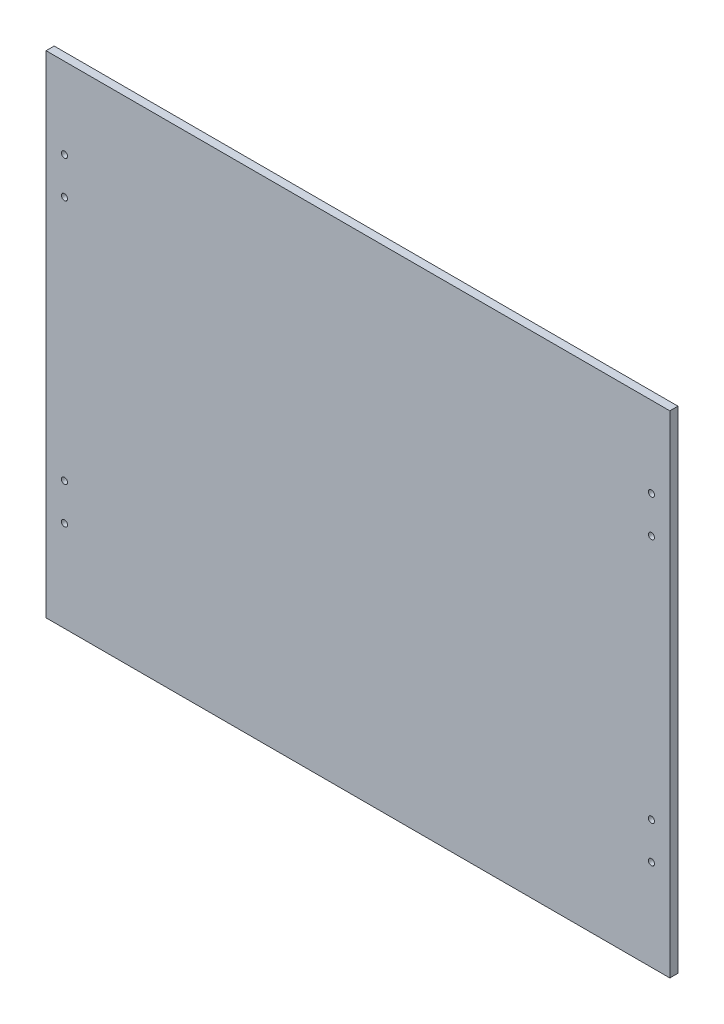
ISO-10303-21;
HEADER;
FILE_DESCRIPTION(('STEP AP214'),'2;1');
FILE_NAME('part.step','',(''),(''),'','','');
FILE_SCHEMA(('AUTOMOTIVE_DESIGN { 1 0 10303 214 1 1 1 1 }'));
ENDSEC;
DATA;
#1=APPLICATION_CONTEXT('core data for automotive mechanical design processes');
#2=APPLICATION_PROTOCOL_DEFINITION('international standard','automotive_design',2000,#1);
#3=PRODUCT_CONTEXT('',#1,'mechanical');
#4=PRODUCT('Part','Part','',(#3));
#5=PRODUCT_RELATED_PRODUCT_CATEGORY('part','',(#4));
#6=PRODUCT_DEFINITION_FORMATION('','',#4);
#7=PRODUCT_DEFINITION_CONTEXT('part definition',#1,'design');
#8=PRODUCT_DEFINITION('design','',#6,#7);
#9=PRODUCT_DEFINITION_SHAPE('','',#8);
#10=(LENGTH_UNIT() NAMED_UNIT(*) SI_UNIT(.MILLI.,.METRE.));
#11=(NAMED_UNIT(*) PLANE_ANGLE_UNIT() SI_UNIT($,.RADIAN.));
#12=(NAMED_UNIT(*) SI_UNIT($,.STERADIAN.) SOLID_ANGLE_UNIT());
#13=UNCERTAINTY_MEASURE_WITH_UNIT(LENGTH_MEASURE(1.E-05),#10,'distance_accuracy_value','');
#14=(GEOMETRIC_REPRESENTATION_CONTEXT(3) GLOBAL_UNCERTAINTY_ASSIGNED_CONTEXT((#13)) GLOBAL_UNIT_ASSIGNED_CONTEXT((#10,
#11,#12)) REPRESENTATION_CONTEXT('',''));
#15=CARTESIAN_POINT('',(0.,0.,0.));
#16=DIRECTION('',(0.,0.,1.));
#17=DIRECTION('',(1.,0.,0.));
#18=AXIS2_PLACEMENT_3D('',#15,#16,#17);
#19=CARTESIAN_POINT('',(0.,0.,3.3));
#20=DIRECTION('',(0.,0.,1.));
#21=DIRECTION('',(1.,0.,0.));
#22=AXIS2_PLACEMENT_3D('',#19,#20,#21);
#23=PLANE('',#22);
#24=CARTESIAN_POINT('',(-107.954545454545,-44.9714285714286,3.3));
#25=DIRECTION('',(0.,0.,1.));
#26=DIRECTION('',(1.,0.,0.));
#27=AXIS2_PLACEMENT_3D('',#24,#25,#26);
#28=CIRCLE('',#27,1.25);
#29=CARTESIAN_POINT('',(-106.704545454545,-44.9714285714286,3.3));
#30=VERTEX_POINT('',#29);
#31=EDGE_CURVE('E145',#30,#30,#28,.T.);
#32=ORIENTED_EDGE('',*,*,#31,.F.);
#33=EDGE_LOOP('',(#32));
#34=FACE_BOUND('',#33,.T.);
#35=CARTESIAN_POINT('',(-107.954545454545,-29.9714285714286,3.3));
#36=DIRECTION('',(0.,0.,1.));
#37=DIRECTION('',(1.,0.,0.));
#38=AXIS2_PLACEMENT_3D('',#35,#36,#37);
#39=CIRCLE('',#38,1.25);
#40=CARTESIAN_POINT('',(-106.704545454545,-29.9714285714286,3.3));
#41=VERTEX_POINT('',#40);
#42=EDGE_CURVE('E133',#41,#41,#39,.T.);
#43=ORIENTED_EDGE('',*,*,#42,.F.);
#44=EDGE_LOOP('',(#43));
#45=FACE_BOUND('',#44,.T.);
#46=CARTESIAN_POINT('',(131.045454545455,85.0285714285714,3.3));
#47=DIRECTION('',(0.,0.,1.));
#48=DIRECTION('',(1.,0.,0.));
#49=AXIS2_PLACEMENT_3D('',#46,#47,#48);
#50=CIRCLE('',#49,1.25000000000001);
#51=CARTESIAN_POINT('',(132.295454545455,85.0285714285714,3.3));
#52=VERTEX_POINT('',#51);
#53=EDGE_CURVE('E121',#52,#52,#50,.T.);
#54=ORIENTED_EDGE('',*,*,#53,.F.);
#55=EDGE_LOOP('',(#54));
#56=FACE_BOUND('',#55,.T.);
#57=CARTESIAN_POINT('',(-107.954545454545,85.0285714285714,3.3));
#58=DIRECTION('',(0.,0.,1.));
#59=DIRECTION('',(1.,0.,0.));
#60=AXIS2_PLACEMENT_3D('',#57,#58,#59);
#61=CIRCLE('',#60,1.25);
#62=CARTESIAN_POINT('',(-106.704545454545,85.0285714285714,3.3));
#63=VERTEX_POINT('',#62);
#64=EDGE_CURVE('E100',#63,#63,#61,.T.);
#65=ORIENTED_EDGE('',*,*,#64,.F.);
#66=EDGE_LOOP('',(#65));
#67=FACE_BOUND('',#66,.T.);
#68=DIRECTION('',(0.,-1.,0.));
#69=VECTOR('',#68,1.);
#70=CARTESIAN_POINT('',(-115.454545454545,117.928571428571,3.3));
#71=LINE('',#70,#69);
#72=CARTESIAN_POINT('',(-115.454545454545,117.928571428571,3.3));
#73=VERTEX_POINT('',#72);
#74=CARTESIAN_POINT('',(-115.454545454545,-82.0714285714286,3.3));
#75=VERTEX_POINT('',#74);
#76=EDGE_CURVE('E85',#73,#75,#71,.T.);
#77=ORIENTED_EDGE('',*,*,#76,.T.);
#78=DIRECTION('',(1.,0.,0.));
#79=VECTOR('',#78,1.);
#80=CARTESIAN_POINT('',(-115.454545454545,-82.0714285714286,3.3));
#81=LINE('',#80,#79);
#82=CARTESIAN_POINT('',(138.545454545455,-82.0714285714286,3.3));
#83=VERTEX_POINT('',#82);
#84=EDGE_CURVE('E80',#75,#83,#81,.T.);
#85=ORIENTED_EDGE('',*,*,#84,.T.);
#86=DIRECTION('',(0.,1.,0.));
#87=VECTOR('',#86,1.);
#88=CARTESIAN_POINT('',(138.545454545455,117.928571428571,3.3));
#89=LINE('',#88,#87);
#90=CARTESIAN_POINT('',(138.545454545455,117.928571428571,3.3));
#91=VERTEX_POINT('',#90);
#92=EDGE_CURVE('E83',#83,#91,#89,.T.);
#93=ORIENTED_EDGE('',*,*,#92,.T.);
#94=DIRECTION('',(-1.,0.,0.));
#95=VECTOR('',#94,1.);
#96=CARTESIAN_POINT('',(-115.454545454545,117.928571428571,3.3));
#97=LINE('',#96,#95);
#98=EDGE_CURVE('E50',#91,#73,#97,.T.);
#99=ORIENTED_EDGE('',*,*,#98,.T.);
#100=EDGE_LOOP('',(#77,#85,#93,#99));
#101=FACE_BOUND('',#100,.T.);
#102=CARTESIAN_POINT('',(-107.954545454545,70.0285714285714,3.3));
#103=DIRECTION('',(0.,0.,1.));
#104=DIRECTION('',(1.,0.,0.));
#105=AXIS2_PLACEMENT_3D('',#102,#103,#104);
#106=CIRCLE('',#105,1.25);
#107=CARTESIAN_POINT('',(-106.704545454545,70.0285714285714,3.3));
#108=VERTEX_POINT('',#107);
#109=EDGE_CURVE('E115',#108,#108,#106,.T.);
#110=ORIENTED_EDGE('',*,*,#109,.F.);
#111=EDGE_LOOP('',(#110));
#112=FACE_BOUND('',#111,.T.);
#113=CARTESIAN_POINT('',(131.045454545455,70.0285714285714,3.3));
#114=DIRECTION('',(0.,0.,1.));
#115=DIRECTION('',(1.,0.,0.));
#116=AXIS2_PLACEMENT_3D('',#113,#114,#115);
#117=CIRCLE('',#116,1.25000000000001);
#118=CARTESIAN_POINT('',(132.295454545455,70.0285714285714,3.3));
#119=VERTEX_POINT('',#118);
#120=EDGE_CURVE('E127',#119,#119,#117,.T.);
#121=ORIENTED_EDGE('',*,*,#120,.F.);
#122=EDGE_LOOP('',(#121));
#123=FACE_BOUND('',#122,.T.);
#124=CARTESIAN_POINT('',(131.045454545455,-29.9714285714286,3.3));
#125=DIRECTION('',(0.,0.,1.));
#126=DIRECTION('',(1.,0.,0.));
#127=AXIS2_PLACEMENT_3D('',#124,#125,#126);
#128=CIRCLE('',#127,1.25000000000001);
#129=CARTESIAN_POINT('',(132.295454545455,-29.9714285714286,3.3));
#130=VERTEX_POINT('',#129);
#131=EDGE_CURVE('E139',#130,#130,#128,.T.);
#132=ORIENTED_EDGE('',*,*,#131,.F.);
#133=EDGE_LOOP('',(#132));
#134=FACE_BOUND('',#133,.T.);
#135=CARTESIAN_POINT('',(131.045454545455,-44.9714285714286,3.3));
#136=DIRECTION('',(0.,0.,1.));
#137=DIRECTION('',(1.,0.,0.));
#138=AXIS2_PLACEMENT_3D('',#135,#136,#137);
#139=CIRCLE('',#138,1.25000000000001);
#140=CARTESIAN_POINT('',(132.295454545455,-44.9714285714286,3.3));
#141=VERTEX_POINT('',#140);
#142=EDGE_CURVE('E151',#141,#141,#139,.T.);
#143=ORIENTED_EDGE('',*,*,#142,.F.);
#144=EDGE_LOOP('',(#143));
#145=FACE_BOUND('',#144,.T.);
#146=ADVANCED_FACE('F33',(#34,#45,#56,#67,#101,#112,#123,#134,#145),#23,.T.);
#147=CARTESIAN_POINT('',(0.,0.,0.));
#148=DIRECTION('',(0.,0.,1.));
#149=DIRECTION('',(1.,0.,0.));
#150=AXIS2_PLACEMENT_3D('',#147,#148,#149);
#151=PLANE('',#150);
#152=DIRECTION('',(0.,-1.,0.));
#153=VECTOR('',#152,1.);
#154=CARTESIAN_POINT('',(-115.454545454545,117.928571428571,0.));
#155=LINE('',#154,#153);
#156=CARTESIAN_POINT('',(-115.454545454545,117.928571428571,0.));
#157=VERTEX_POINT('',#156);
#158=CARTESIAN_POINT('',(-115.454545454545,-82.0714285714286,0.));
#159=VERTEX_POINT('',#158);
#160=EDGE_CURVE('E97',#157,#159,#155,.T.);
#161=ORIENTED_EDGE('',*,*,#160,.F.);
#162=DIRECTION('',(-1.,0.,0.));
#163=VECTOR('',#162,1.);
#164=CARTESIAN_POINT('',(-115.454545454545,117.928571428571,0.));
#165=LINE('',#164,#163);
#166=CARTESIAN_POINT('',(138.545454545455,117.928571428571,0.));
#167=VERTEX_POINT('',#166);
#168=EDGE_CURVE('E73',#167,#157,#165,.T.);
#169=ORIENTED_EDGE('',*,*,#168,.F.);
#170=DIRECTION('',(0.,1.,0.));
#171=VECTOR('',#170,1.);
#172=CARTESIAN_POINT('',(138.545454545455,117.928571428571,0.));
#173=LINE('',#172,#171);
#174=CARTESIAN_POINT('',(138.545454545455,-82.0714285714286,0.));
#175=VERTEX_POINT('',#174);
#176=EDGE_CURVE('E67',#175,#167,#173,.T.);
#177=ORIENTED_EDGE('',*,*,#176,.F.);
#178=DIRECTION('',(1.,0.,0.));
#179=VECTOR('',#178,1.);
#180=CARTESIAN_POINT('',(-115.454545454545,-82.0714285714286,0.));
#181=LINE('',#180,#179);
#182=EDGE_CURVE('E89',#159,#175,#181,.T.);
#183=ORIENTED_EDGE('',*,*,#182,.F.);
#184=EDGE_LOOP('',(#161,#169,#177,#183));
#185=FACE_BOUND('',#184,.T.);
#186=CARTESIAN_POINT('',(-107.954545454545,85.0285714285714,0.));
#187=DIRECTION('',(0.,0.,1.));
#188=DIRECTION('',(1.,0.,0.));
#189=AXIS2_PLACEMENT_3D('',#186,#187,#188);
#190=CIRCLE('',#189,1.25);
#191=CARTESIAN_POINT('',(-106.704545454545,85.0285714285714,0.));
#192=VERTEX_POINT('',#191);
#193=EDGE_CURVE('E112',#192,#192,#190,.T.);
#194=ORIENTED_EDGE('',*,*,#193,.T.);
#195=EDGE_LOOP('',(#194));
#196=FACE_BOUND('',#195,.T.);
#197=CARTESIAN_POINT('',(-107.954545454545,70.0285714285714,0.));
#198=DIRECTION('',(0.,0.,1.));
#199=DIRECTION('',(1.,0.,0.));
#200=AXIS2_PLACEMENT_3D('',#197,#198,#199);
#201=CIRCLE('',#200,1.25);
#202=CARTESIAN_POINT('',(-106.704545454545,70.0285714285714,0.));
#203=VERTEX_POINT('',#202);
#204=EDGE_CURVE('E118',#203,#203,#201,.T.);
#205=ORIENTED_EDGE('',*,*,#204,.T.);
#206=EDGE_LOOP('',(#205));
#207=FACE_BOUND('',#206,.T.);
#208=CARTESIAN_POINT('',(131.045454545455,85.0285714285714,0.));
#209=DIRECTION('',(0.,0.,1.));
#210=DIRECTION('',(1.,0.,0.));
#211=AXIS2_PLACEMENT_3D('',#208,#209,#210);
#212=CIRCLE('',#211,1.25000000000001);
#213=CARTESIAN_POINT('',(132.295454545455,85.0285714285714,0.));
#214=VERTEX_POINT('',#213);
#215=EDGE_CURVE('E124',#214,#214,#212,.T.);
#216=ORIENTED_EDGE('',*,*,#215,.T.);
#217=EDGE_LOOP('',(#216));
#218=FACE_BOUND('',#217,.T.);
#219=CARTESIAN_POINT('',(131.045454545455,70.0285714285714,0.));
#220=DIRECTION('',(0.,0.,1.));
#221=DIRECTION('',(1.,0.,0.));
#222=AXIS2_PLACEMENT_3D('',#219,#220,#221);
#223=CIRCLE('',#222,1.25000000000001);
#224=CARTESIAN_POINT('',(132.295454545455,70.0285714285714,0.));
#225=VERTEX_POINT('',#224);
#226=EDGE_CURVE('E130',#225,#225,#223,.T.);
#227=ORIENTED_EDGE('',*,*,#226,.T.);
#228=EDGE_LOOP('',(#227));
#229=FACE_BOUND('',#228,.T.);
#230=CARTESIAN_POINT('',(-107.954545454545,-29.9714285714286,0.));
#231=DIRECTION('',(0.,0.,1.));
#232=DIRECTION('',(1.,0.,0.));
#233=AXIS2_PLACEMENT_3D('',#230,#231,#232);
#234=CIRCLE('',#233,1.25);
#235=CARTESIAN_POINT('',(-106.704545454545,-29.9714285714286,0.));
#236=VERTEX_POINT('',#235);
#237=EDGE_CURVE('E136',#236,#236,#234,.T.);
#238=ORIENTED_EDGE('',*,*,#237,.T.);
#239=EDGE_LOOP('',(#238));
#240=FACE_BOUND('',#239,.T.);
#241=CARTESIAN_POINT('',(131.045454545455,-29.9714285714286,0.));
#242=DIRECTION('',(0.,0.,1.));
#243=DIRECTION('',(1.,0.,0.));
#244=AXIS2_PLACEMENT_3D('',#241,#242,#243);
#245=CIRCLE('',#244,1.25000000000001);
#246=CARTESIAN_POINT('',(132.295454545455,-29.9714285714286,0.));
#247=VERTEX_POINT('',#246);
#248=EDGE_CURVE('E142',#247,#247,#245,.T.);
#249=ORIENTED_EDGE('',*,*,#248,.T.);
#250=EDGE_LOOP('',(#249));
#251=FACE_BOUND('',#250,.T.);
#252=CARTESIAN_POINT('',(-107.954545454545,-44.9714285714286,0.));
#253=DIRECTION('',(0.,0.,1.));
#254=DIRECTION('',(1.,0.,0.));
#255=AXIS2_PLACEMENT_3D('',#252,#253,#254);
#256=CIRCLE('',#255,1.25);
#257=CARTESIAN_POINT('',(-106.704545454545,-44.9714285714286,0.));
#258=VERTEX_POINT('',#257);
#259=EDGE_CURVE('E148',#258,#258,#256,.T.);
#260=ORIENTED_EDGE('',*,*,#259,.T.);
#261=EDGE_LOOP('',(#260));
#262=FACE_BOUND('',#261,.T.);
#263=CARTESIAN_POINT('',(131.045454545455,-44.9714285714286,0.));
#264=DIRECTION('',(0.,0.,1.));
#265=DIRECTION('',(1.,0.,0.));
#266=AXIS2_PLACEMENT_3D('',#263,#264,#265);
#267=CIRCLE('',#266,1.25000000000001);
#268=CARTESIAN_POINT('',(132.295454545455,-44.9714285714286,0.));
#269=VERTEX_POINT('',#268);
#270=EDGE_CURVE('E154',#269,#269,#267,.T.);
#271=ORIENTED_EDGE('',*,*,#270,.T.);
#272=EDGE_LOOP('',(#271));
#273=FACE_BOUND('',#272,.T.);
#274=ADVANCED_FACE('F108',(#185,#196,#207,#218,#229,#240,#251,#262,#273),#151,.F.);
#275=CARTESIAN_POINT('',(-115.454545454545,117.928571428571,3.3));
#276=DIRECTION('',(1.,0.,0.));
#277=DIRECTION('',(0.,1.,0.));
#278=AXIS2_PLACEMENT_3D('',#275,#276,#277);
#279=PLANE('',#278);
#280=ORIENTED_EDGE('',*,*,#160,.T.);
#281=DIRECTION('',(0.,0.,-1.));
#282=VECTOR('',#281,1.);
#283=CARTESIAN_POINT('',(-115.454545454545,-82.0714285714286,3.3));
#284=LINE('',#283,#282);
#285=EDGE_CURVE('E11',#75,#159,#284,.T.);
#286=ORIENTED_EDGE('',*,*,#285,.F.);
#287=ORIENTED_EDGE('',*,*,#76,.F.);
#288=DIRECTION('',(0.,0.,-1.));
#289=VECTOR('',#288,1.);
#290=CARTESIAN_POINT('',(-115.454545454545,117.928571428571,3.3));
#291=LINE('',#290,#289);
#292=EDGE_CURVE('E93',#73,#157,#291,.T.);
#293=ORIENTED_EDGE('',*,*,#292,.T.);
#294=EDGE_LOOP('',(#280,#286,#287,#293));
#295=FACE_BOUND('',#294,.T.);
#296=ADVANCED_FACE('F35',(#295),#279,.F.);
#297=CARTESIAN_POINT('',(-115.454545454545,-82.0714285714286,3.3));
#298=DIRECTION('',(0.,1.,0.));
#299=DIRECTION('',(0.,0.,1.));
#300=AXIS2_PLACEMENT_3D('',#297,#298,#299);
#301=PLANE('',#300);
#302=ORIENTED_EDGE('',*,*,#182,.T.);
#303=DIRECTION('',(0.,0.,-1.));
#304=VECTOR('',#303,1.);
#305=CARTESIAN_POINT('',(138.545454545455,-82.0714285714286,3.3));
#306=LINE('',#305,#304);
#307=EDGE_CURVE('E42',#83,#175,#306,.T.);
#308=ORIENTED_EDGE('',*,*,#307,.F.);
#309=ORIENTED_EDGE('',*,*,#84,.F.);
#310=ORIENTED_EDGE('',*,*,#285,.T.);
#311=EDGE_LOOP('',(#302,#308,#309,#310));
#312=FACE_BOUND('',#311,.T.);
#313=ADVANCED_FACE('F88',(#312),#301,.F.);
#314=CARTESIAN_POINT('',(138.545454545455,117.928571428571,3.3));
#315=DIRECTION('',(-1.,0.,0.));
#316=DIRECTION('',(0.,-1.,0.));
#317=AXIS2_PLACEMENT_3D('',#314,#315,#316);
#318=PLANE('',#317);
#319=ORIENTED_EDGE('',*,*,#176,.T.);
#320=DIRECTION('',(0.,0.,-1.));
#321=VECTOR('',#320,1.);
#322=CARTESIAN_POINT('',(138.545454545455,117.928571428571,3.3));
#323=LINE('',#322,#321);
#324=EDGE_CURVE('E90',#91,#167,#323,.T.);
#325=ORIENTED_EDGE('',*,*,#324,.F.);
#326=ORIENTED_EDGE('',*,*,#92,.F.);
#327=ORIENTED_EDGE('',*,*,#307,.T.);
#328=EDGE_LOOP('',(#319,#325,#326,#327));
#329=FACE_BOUND('',#328,.T.);
#330=ADVANCED_FACE('F91',(#329),#318,.F.);
#331=CARTESIAN_POINT('',(-115.454545454545,117.928571428571,3.3));
#332=DIRECTION('',(0.,-1.,0.));
#333=DIRECTION('',(0.,0.,-1.));
#334=AXIS2_PLACEMENT_3D('',#331,#332,#333);
#335=PLANE('',#334);
#336=ORIENTED_EDGE('',*,*,#168,.T.);
#337=ORIENTED_EDGE('',*,*,#292,.F.);
#338=ORIENTED_EDGE('',*,*,#98,.F.);
#339=ORIENTED_EDGE('',*,*,#324,.T.);
#340=EDGE_LOOP('',(#336,#337,#338,#339));
#341=FACE_BOUND('',#340,.T.);
#342=ADVANCED_FACE('F105',(#341),#335,.F.);
#343=CARTESIAN_POINT('',(-107.954545454545,85.0285714285714,3.3));
#344=DIRECTION('',(0.,0.,-1.));
#345=DIRECTION('',(-1.,0.,0.));
#346=AXIS2_PLACEMENT_3D('',#343,#344,#345);
#347=CYLINDRICAL_SURFACE('',#346,1.25);
#348=ORIENTED_EDGE('',*,*,#64,.T.);
#349=EDGE_LOOP('',(#348));
#350=FACE_BOUND('',#349,.T.);
#351=ORIENTED_EDGE('',*,*,#193,.F.);
#352=EDGE_LOOP('',(#351));
#353=FACE_BOUND('',#352,.T.);
#354=ADVANCED_FACE('F173',(#350,#353),#347,.F.);
#355=CARTESIAN_POINT('',(-107.954545454545,70.0285714285714,3.3));
#356=DIRECTION('',(0.,0.,-1.));
#357=DIRECTION('',(-1.,0.,0.));
#358=AXIS2_PLACEMENT_3D('',#355,#356,#357);
#359=CYLINDRICAL_SURFACE('',#358,1.25);
#360=ORIENTED_EDGE('',*,*,#109,.T.);
#361=EDGE_LOOP('',(#360));
#362=FACE_BOUND('',#361,.T.);
#363=ORIENTED_EDGE('',*,*,#204,.F.);
#364=EDGE_LOOP('',(#363));
#365=FACE_BOUND('',#364,.T.);
#366=ADVANCED_FACE('F219',(#362,#365),#359,.F.);
#367=CARTESIAN_POINT('',(131.045454545455,85.0285714285714,3.3));
#368=DIRECTION('',(0.,0.,-1.));
#369=DIRECTION('',(-1.,0.,0.));
#370=AXIS2_PLACEMENT_3D('',#367,#368,#369);
#371=CYLINDRICAL_SURFACE('',#370,1.25000000000001);
#372=ORIENTED_EDGE('',*,*,#53,.T.);
#373=EDGE_LOOP('',(#372));
#374=FACE_BOUND('',#373,.T.);
#375=ORIENTED_EDGE('',*,*,#215,.F.);
#376=EDGE_LOOP('',(#375));
#377=FACE_BOUND('',#376,.T.);
#378=ADVANCED_FACE('F227',(#374,#377),#371,.F.);
#379=CARTESIAN_POINT('',(131.045454545455,70.0285714285714,3.3));
#380=DIRECTION('',(0.,0.,-1.));
#381=DIRECTION('',(-1.,0.,0.));
#382=AXIS2_PLACEMENT_3D('',#379,#380,#381);
#383=CYLINDRICAL_SURFACE('',#382,1.25000000000001);
#384=ORIENTED_EDGE('',*,*,#120,.T.);
#385=EDGE_LOOP('',(#384));
#386=FACE_BOUND('',#385,.T.);
#387=ORIENTED_EDGE('',*,*,#226,.F.);
#388=EDGE_LOOP('',(#387));
#389=FACE_BOUND('',#388,.T.);
#390=ADVANCED_FACE('F235',(#386,#389),#383,.F.);
#391=CARTESIAN_POINT('',(-107.954545454545,-29.9714285714286,3.3));
#392=DIRECTION('',(0.,0.,-1.));
#393=DIRECTION('',(-1.,0.,0.));
#394=AXIS2_PLACEMENT_3D('',#391,#392,#393);
#395=CYLINDRICAL_SURFACE('',#394,1.25);
#396=ORIENTED_EDGE('',*,*,#42,.T.);
#397=EDGE_LOOP('',(#396));
#398=FACE_BOUND('',#397,.T.);
#399=ORIENTED_EDGE('',*,*,#237,.F.);
#400=EDGE_LOOP('',(#399));
#401=FACE_BOUND('',#400,.T.);
#402=ADVANCED_FACE('F244',(#398,#401),#395,.F.);
#403=CARTESIAN_POINT('',(131.045454545455,-29.9714285714286,3.3));
#404=DIRECTION('',(0.,0.,-1.));
#405=DIRECTION('',(-1.,0.,0.));
#406=AXIS2_PLACEMENT_3D('',#403,#404,#405);
#407=CYLINDRICAL_SURFACE('',#406,1.25000000000001);
#408=ORIENTED_EDGE('',*,*,#131,.T.);
#409=EDGE_LOOP('',(#408));
#410=FACE_BOUND('',#409,.T.);
#411=ORIENTED_EDGE('',*,*,#248,.F.);
#412=EDGE_LOOP('',(#411));
#413=FACE_BOUND('',#412,.T.);
#414=ADVANCED_FACE('F253',(#410,#413),#407,.F.);
#415=CARTESIAN_POINT('',(-107.954545454545,-44.9714285714286,3.3));
#416=DIRECTION('',(0.,0.,-1.));
#417=DIRECTION('',(-1.,0.,0.));
#418=AXIS2_PLACEMENT_3D('',#415,#416,#417);
#419=CYLINDRICAL_SURFACE('',#418,1.25);
#420=ORIENTED_EDGE('',*,*,#31,.T.);
#421=EDGE_LOOP('',(#420));
#422=FACE_BOUND('',#421,.T.);
#423=ORIENTED_EDGE('',*,*,#259,.F.);
#424=EDGE_LOOP('',(#423));
#425=FACE_BOUND('',#424,.T.);
#426=ADVANCED_FACE('F262',(#422,#425),#419,.F.);
#427=CARTESIAN_POINT('',(131.045454545455,-44.9714285714286,3.3));
#428=DIRECTION('',(0.,0.,-1.));
#429=DIRECTION('',(-1.,0.,0.));
#430=AXIS2_PLACEMENT_3D('',#427,#428,#429);
#431=CYLINDRICAL_SURFACE('',#430,1.25000000000001);
#432=ORIENTED_EDGE('',*,*,#142,.T.);
#433=EDGE_LOOP('',(#432));
#434=FACE_BOUND('',#433,.T.);
#435=ORIENTED_EDGE('',*,*,#270,.F.);
#436=EDGE_LOOP('',(#435));
#437=FACE_BOUND('',#436,.T.);
#438=ADVANCED_FACE('F160',(#434,#437),#431,.F.);
#439=CLOSED_SHELL('',(#146,#274,#296,#313,#330,#342,#354,#366,#378,#390,#402,#414,#426,#438));
#440=MANIFOLD_SOLID_BREP('B2',#439);
#441=ADVANCED_BREP_SHAPE_REPRESENTATION('',(#18,#440),#14);
#442=SHAPE_DEFINITION_REPRESENTATION(#9,#441);
ENDSEC;
END-ISO-10303-21;
